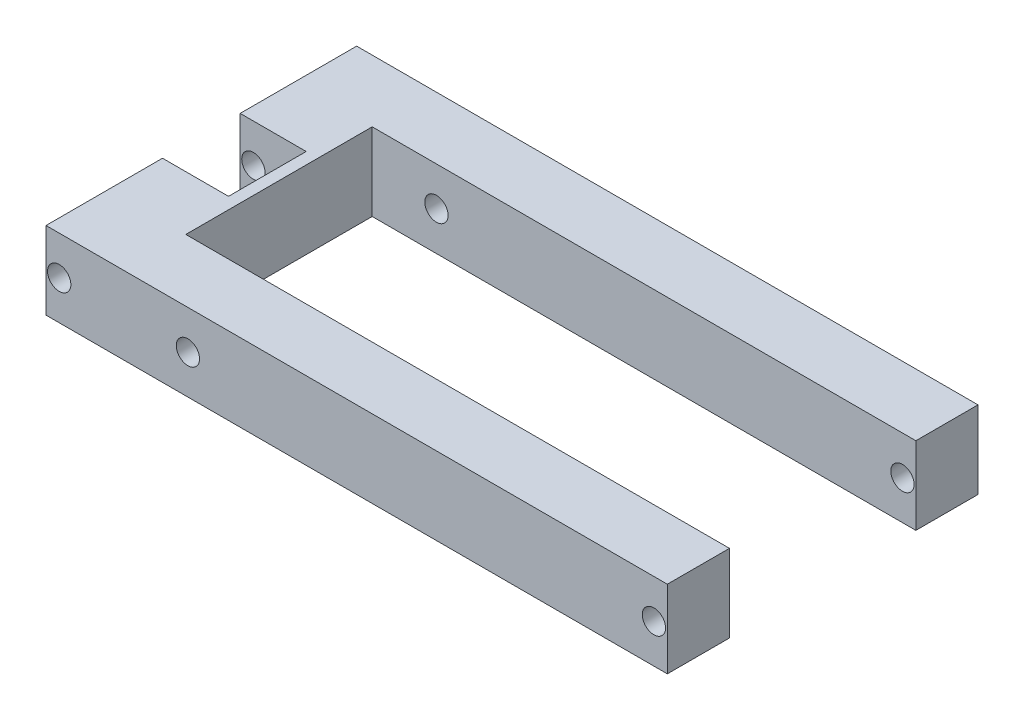
ISO-10303-21;
HEADER;
FILE_DESCRIPTION(('STEP AP214'),'2;1');
FILE_NAME('part.step','',(''),(''),'','','');
FILE_SCHEMA(('AUTOMOTIVE_DESIGN { 1 0 10303 214 1 1 1 1 }'));
ENDSEC;
DATA;
#1=APPLICATION_CONTEXT('core data for automotive mechanical design processes');
#2=APPLICATION_PROTOCOL_DEFINITION('international standard','automotive_design',2000,#1);
#3=PRODUCT_CONTEXT('',#1,'mechanical');
#4=PRODUCT('Part','Part','',(#3));
#5=PRODUCT_RELATED_PRODUCT_CATEGORY('part','',(#4));
#6=PRODUCT_DEFINITION_FORMATION('','',#4);
#7=PRODUCT_DEFINITION_CONTEXT('part definition',#1,'design');
#8=PRODUCT_DEFINITION('design','',#6,#7);
#9=PRODUCT_DEFINITION_SHAPE('','',#8);
#10=(LENGTH_UNIT() NAMED_UNIT(*) SI_UNIT(.MILLI.,.METRE.));
#11=(NAMED_UNIT(*) PLANE_ANGLE_UNIT() SI_UNIT($,.RADIAN.));
#12=(NAMED_UNIT(*) SI_UNIT($,.STERADIAN.) SOLID_ANGLE_UNIT());
#13=UNCERTAINTY_MEASURE_WITH_UNIT(LENGTH_MEASURE(1.E-05),#10,'distance_accuracy_value','');
#14=(GEOMETRIC_REPRESENTATION_CONTEXT(3) GLOBAL_UNCERTAINTY_ASSIGNED_CONTEXT((#13)) GLOBAL_UNIT_ASSIGNED_CONTEXT((#10,
#11,#12)) REPRESENTATION_CONTEXT('',''));
#15=CARTESIAN_POINT('',(0.,0.,0.));
#16=DIRECTION('',(0.,0.,1.));
#17=DIRECTION('',(1.,0.,0.));
#18=AXIS2_PLACEMENT_3D('',#15,#16,#17);
#19=CARTESIAN_POINT('',(-332.846822005894,100.,200.));
#20=DIRECTION('',(1.,0.,0.));
#21=DIRECTION('',(0.,0.,-1.));
#22=AXIS2_PLACEMENT_3D('',#19,#20,#21);
#23=PLANE('',#22);
#24=DIRECTION('',(0.,-1.,0.));
#25=VECTOR('',#24,1.);
#26=CARTESIAN_POINT('',(-332.846822005894,100.,50.));
#27=LINE('',#26,#25);
#28=CARTESIAN_POINT('',(-332.846822005894,100.,50.));
#29=VERTEX_POINT('',#28);
#30=CARTESIAN_POINT('',(-332.846822005894,0.,50.));
#31=VERTEX_POINT('',#30);
#32=EDGE_CURVE('E215',#29,#31,#27,.T.);
#33=ORIENTED_EDGE('',*,*,#32,.T.);
#34=DIRECTION('',(0.,0.,1.));
#35=VECTOR('',#34,1.);
#36=CARTESIAN_POINT('',(-332.846822005894,0.,200.));
#37=LINE('',#36,#35);
#38=CARTESIAN_POINT('',(-332.846822005894,0.,200.));
#39=VERTEX_POINT('',#38);
#40=EDGE_CURVE('E144',#31,#39,#37,.T.);
#41=ORIENTED_EDGE('',*,*,#40,.T.);
#42=DIRECTION('',(0.,-1.,0.));
#43=VECTOR('',#42,1.);
#44=CARTESIAN_POINT('',(-332.846822005894,100.,200.));
#45=LINE('',#44,#43);
#46=CARTESIAN_POINT('',(-332.846822005894,100.,200.));
#47=VERTEX_POINT('',#46);
#48=EDGE_CURVE('E142',#47,#39,#45,.T.);
#49=ORIENTED_EDGE('',*,*,#48,.F.);
#50=DIRECTION('',(0.,0.,1.));
#51=VECTOR('',#50,1.);
#52=CARTESIAN_POINT('',(-332.846822005894,100.,200.));
#53=LINE('',#52,#51);
#54=EDGE_CURVE('E124',#29,#47,#53,.T.);
#55=ORIENTED_EDGE('',*,*,#54,.F.);
#56=EDGE_LOOP('',(#33,#41,#49,#55));
#57=FACE_BOUND('',#56,.T.);
#58=ADVANCED_FACE('F39',(#57),#23,.F.);
#59=CARTESIAN_POINT('',(-315.846822005894,50.,-200.));
#60=DIRECTION('',(0.,0.,1.));
#61=DIRECTION('',(1.,0.,0.));
#62=AXIS2_PLACEMENT_3D('',#59,#60,#61);
#63=CYLINDRICAL_SURFACE('',#62,15.);
#64=CARTESIAN_POINT('',(-315.846822005894,50.,200.));
#65=DIRECTION('',(0.,0.,1.));
#66=DIRECTION('',(1.,0.,0.));
#67=AXIS2_PLACEMENT_3D('',#64,#65,#66);
#68=CIRCLE('',#67,15.);
#69=CARTESIAN_POINT('',(-300.846822005894,50.,200.));
#70=VERTEX_POINT('',#69);
#71=EDGE_CURVE('E232',#70,#70,#68,.T.);
#72=ORIENTED_EDGE('',*,*,#71,.T.);
#73=EDGE_LOOP('',(#72));
#74=FACE_BOUND('',#73,.T.);
#75=CARTESIAN_POINT('',(-315.846822005894,50.,50.));
#76=DIRECTION('',(0.,0.,-1.));
#77=DIRECTION('',(-1.,0.,0.));
#78=AXIS2_PLACEMENT_3D('',#75,#76,#77);
#79=CIRCLE('',#78,15.);
#80=CARTESIAN_POINT('',(-330.846822005894,50.,50.));
#81=VERTEX_POINT('',#80);
#82=EDGE_CURVE('E205',#81,#81,#79,.F.);
#83=ORIENTED_EDGE('',*,*,#82,.F.);
#84=EDGE_LOOP('',(#83));
#85=FACE_BOUND('',#84,.T.);
#86=ADVANCED_FACE('F352',(#74,#85),#63,.F.);
#87=CARTESIAN_POINT('',(467.153177994106,100.,120.));
#88=DIRECTION('',(0.,0.,1.));
#89=DIRECTION('',(1.,0.,0.));
#90=AXIS2_PLACEMENT_3D('',#87,#88,#89);
#91=PLANE('',#90);
#92=CARTESIAN_POINT('',(-150.146822005894,50.,120.));
#93=DIRECTION('',(0.,0.,1.));
#94=DIRECTION('',(1.,0.,0.));
#95=AXIS2_PLACEMENT_3D('',#92,#93,#94);
#96=CIRCLE('',#95,15.0000000000001);
#97=CARTESIAN_POINT('',(-135.146822005894,50.,120.));
#98=VERTEX_POINT('',#97);
#99=EDGE_CURVE('E166',#98,#98,#96,.T.);
#100=ORIENTED_EDGE('',*,*,#99,.T.);
#101=EDGE_LOOP('',(#100));
#102=FACE_BOUND('',#101,.T.);
#103=CARTESIAN_POINT('',(449.853177994106,50.,120.));
#104=DIRECTION('',(0.,0.,1.));
#105=DIRECTION('',(1.,0.,0.));
#106=AXIS2_PLACEMENT_3D('',#103,#104,#105);
#107=CIRCLE('',#106,15.);
#108=CARTESIAN_POINT('',(464.853177994106,50.,120.));
#109=VERTEX_POINT('',#108);
#110=EDGE_CURVE('E259',#109,#109,#107,.T.);
#111=ORIENTED_EDGE('',*,*,#110,.T.);
#112=EDGE_LOOP('',(#111));
#113=FACE_BOUND('',#112,.T.);
#114=DIRECTION('',(-1.,0.,0.));
#115=VECTOR('',#114,1.);
#116=CARTESIAN_POINT('',(467.153177994106,0.,120.));
#117=LINE('',#116,#115);
#118=CARTESIAN_POINT('',(467.153177994106,0.,120.));
#119=VERTEX_POINT('',#118);
#120=CARTESIAN_POINT('',(-232.846822005894,0.,120.));
#121=VERTEX_POINT('',#120);
#122=EDGE_CURVE('E161',#119,#121,#117,.T.);
#123=ORIENTED_EDGE('',*,*,#122,.T.);
#124=DIRECTION('',(0.,-1.,0.));
#125=VECTOR('',#124,1.);
#126=CARTESIAN_POINT('',(-232.846822005894,100.,120.));
#127=LINE('',#126,#125);
#128=CARTESIAN_POINT('',(-232.846822005894,100.,120.));
#129=VERTEX_POINT('',#128);
#130=EDGE_CURVE('E11',#129,#121,#127,.T.);
#131=ORIENTED_EDGE('',*,*,#130,.F.);
#132=DIRECTION('',(-1.,0.,0.));
#133=VECTOR('',#132,1.);
#134=CARTESIAN_POINT('',(467.153177994106,100.,120.));
#135=LINE('',#134,#133);
#136=CARTESIAN_POINT('',(467.153177994106,100.,120.));
#137=VERTEX_POINT('',#136);
#138=EDGE_CURVE('E187',#137,#129,#135,.T.);
#139=ORIENTED_EDGE('',*,*,#138,.F.);
#140=DIRECTION('',(0.,-1.,0.));
#141=VECTOR('',#140,1.);
#142=CARTESIAN_POINT('',(467.153177994106,100.,120.));
#143=LINE('',#142,#141);
#144=EDGE_CURVE('E156',#137,#119,#143,.T.);
#145=ORIENTED_EDGE('',*,*,#144,.T.);
#146=EDGE_LOOP('',(#123,#131,#139,#145));
#147=FACE_BOUND('',#146,.T.);
#148=ADVANCED_FACE('F41',(#102,#113,#147),#91,.F.);
#149=CARTESIAN_POINT('',(-232.846822005894,100.,-120.));
#150=DIRECTION('',(-1.,0.,0.));
#151=DIRECTION('',(0.,0.,1.));
#152=AXIS2_PLACEMENT_3D('',#149,#150,#151);
#153=PLANE('',#152);
#154=DIRECTION('',(0.,0.,-1.));
#155=VECTOR('',#154,1.);
#156=CARTESIAN_POINT('',(-232.846822005894,0.,-120.));
#157=LINE('',#156,#155);
#158=CARTESIAN_POINT('',(-232.846822005894,0.,-120.));
#159=VERTEX_POINT('',#158);
#160=EDGE_CURVE('E165',#121,#159,#157,.T.);
#161=ORIENTED_EDGE('',*,*,#160,.T.);
#162=DIRECTION('',(0.,-1.,0.));
#163=VECTOR('',#162,1.);
#164=CARTESIAN_POINT('',(-232.846822005894,100.,-120.));
#165=LINE('',#164,#163);
#166=CARTESIAN_POINT('',(-232.846822005894,100.,-120.));
#167=VERTEX_POINT('',#166);
#168=EDGE_CURVE('E49',#167,#159,#165,.T.);
#169=ORIENTED_EDGE('',*,*,#168,.F.);
#170=DIRECTION('',(0.,0.,-1.));
#171=VECTOR('',#170,1.);
#172=CARTESIAN_POINT('',(-232.846822005894,100.,-120.));
#173=LINE('',#172,#171);
#174=EDGE_CURVE('E107',#129,#167,#173,.T.);
#175=ORIENTED_EDGE('',*,*,#174,.F.);
#176=ORIENTED_EDGE('',*,*,#130,.T.);
#177=EDGE_LOOP('',(#161,#169,#175,#176));
#178=FACE_BOUND('',#177,.T.);
#179=ADVANCED_FACE('F334',(#178),#153,.F.);
#180=CARTESIAN_POINT('',(467.153177994106,100.,-120.));
#181=DIRECTION('',(0.,0.,-1.));
#182=DIRECTION('',(-1.,0.,0.));
#183=AXIS2_PLACEMENT_3D('',#180,#181,#182);
#184=PLANE('',#183);
#185=CARTESIAN_POINT('',(-150.146822005894,50.,-120.));
#186=DIRECTION('',(0.,0.,-1.));
#187=DIRECTION('',(-1.,0.,0.));
#188=AXIS2_PLACEMENT_3D('',#185,#186,#187);
#189=CIRCLE('',#188,15.0000000000001);
#190=CARTESIAN_POINT('',(-165.146822005894,50.,-120.));
#191=VERTEX_POINT('',#190);
#192=EDGE_CURVE('E263',#191,#191,#189,.T.);
#193=ORIENTED_EDGE('',*,*,#192,.T.);
#194=EDGE_LOOP('',(#193));
#195=FACE_BOUND('',#194,.T.);
#196=CARTESIAN_POINT('',(449.853177994106,50.,-120.));
#197=DIRECTION('',(0.,0.,-1.));
#198=DIRECTION('',(-1.,0.,0.));
#199=AXIS2_PLACEMENT_3D('',#196,#197,#198);
#200=CIRCLE('',#199,15.);
#201=CARTESIAN_POINT('',(434.853177994106,50.,-120.));
#202=VERTEX_POINT('',#201);
#203=EDGE_CURVE('E241',#202,#202,#200,.T.);
#204=ORIENTED_EDGE('',*,*,#203,.T.);
#205=EDGE_LOOP('',(#204));
#206=FACE_BOUND('',#205,.T.);
#207=DIRECTION('',(1.,0.,0.));
#208=VECTOR('',#207,1.);
#209=CARTESIAN_POINT('',(467.153177994106,0.,-120.));
#210=LINE('',#209,#208);
#211=CARTESIAN_POINT('',(467.153177994106,0.,-120.));
#212=VERTEX_POINT('',#211);
#213=EDGE_CURVE('E169',#159,#212,#210,.T.);
#214=ORIENTED_EDGE('',*,*,#213,.T.);
#215=DIRECTION('',(0.,-1.,0.));
#216=VECTOR('',#215,1.);
#217=CARTESIAN_POINT('',(467.153177994106,100.,-120.));
#218=LINE('',#217,#216);
#219=CARTESIAN_POINT('',(467.153177994106,100.,-120.));
#220=VERTEX_POINT('',#219);
#221=EDGE_CURVE('E199',#220,#212,#218,.T.);
#222=ORIENTED_EDGE('',*,*,#221,.F.);
#223=DIRECTION('',(1.,0.,0.));
#224=VECTOR('',#223,1.);
#225=CARTESIAN_POINT('',(467.153177994106,100.,-120.));
#226=LINE('',#225,#224);
#227=EDGE_CURVE('E274',#167,#220,#226,.T.);
#228=ORIENTED_EDGE('',*,*,#227,.F.);
#229=ORIENTED_EDGE('',*,*,#168,.T.);
#230=EDGE_LOOP('',(#214,#222,#228,#229));
#231=FACE_BOUND('',#230,.T.);
#232=ADVANCED_FACE('F337',(#195,#206,#231),#184,.F.);
#233=CARTESIAN_POINT('',(467.153177994106,100.,-200.));
#234=DIRECTION('',(-1.,0.,0.));
#235=DIRECTION('',(0.,0.,1.));
#236=AXIS2_PLACEMENT_3D('',#233,#234,#235);
#237=PLANE('',#236);
#238=DIRECTION('',(0.,0.,-1.));
#239=VECTOR('',#238,1.);
#240=CARTESIAN_POINT('',(467.153177994106,0.,-200.));
#241=LINE('',#240,#239);
#242=CARTESIAN_POINT('',(467.153177994106,0.,-200.));
#243=VERTEX_POINT('',#242);
#244=EDGE_CURVE('E172',#212,#243,#241,.T.);
#245=ORIENTED_EDGE('',*,*,#244,.T.);
#246=DIRECTION('',(0.,-1.,0.));
#247=VECTOR('',#246,1.);
#248=CARTESIAN_POINT('',(467.153177994106,100.,-200.));
#249=LINE('',#248,#247);
#250=CARTESIAN_POINT('',(467.153177994106,100.,-200.));
#251=VERTEX_POINT('',#250);
#252=EDGE_CURVE('E195',#251,#243,#249,.T.);
#253=ORIENTED_EDGE('',*,*,#252,.F.);
#254=DIRECTION('',(0.,0.,-1.));
#255=VECTOR('',#254,1.);
#256=CARTESIAN_POINT('',(467.153177994106,100.,-200.));
#257=LINE('',#256,#255);
#258=EDGE_CURVE('E277',#220,#251,#257,.T.);
#259=ORIENTED_EDGE('',*,*,#258,.F.);
#260=ORIENTED_EDGE('',*,*,#221,.T.);
#261=EDGE_LOOP('',(#245,#253,#259,#260));
#262=FACE_BOUND('',#261,.T.);
#263=ADVANCED_FACE('F340',(#262),#237,.F.);
#264=CARTESIAN_POINT('',(-332.846822005894,100.,-200.));
#265=DIRECTION('',(0.,0.,1.));
#266=DIRECTION('',(1.,0.,0.));
#267=AXIS2_PLACEMENT_3D('',#264,#265,#266);
#268=PLANE('',#267);
#269=CARTESIAN_POINT('',(-315.846822005894,50.,-200.));
#270=DIRECTION('',(0.,0.,1.));
#271=DIRECTION('',(1.,0.,0.));
#272=AXIS2_PLACEMENT_3D('',#269,#270,#271);
#273=CIRCLE('',#272,15.);
#274=CARTESIAN_POINT('',(-300.846822005894,50.,-200.));
#275=VERTEX_POINT('',#274);
#276=EDGE_CURVE('E236',#275,#275,#273,.T.);
#277=ORIENTED_EDGE('',*,*,#276,.T.);
#278=EDGE_LOOP('',(#277));
#279=FACE_BOUND('',#278,.T.);
#280=CARTESIAN_POINT('',(-150.146822005894,50.,-200.));
#281=DIRECTION('',(0.,0.,1.));
#282=DIRECTION('',(1.,0.,0.));
#283=AXIS2_PLACEMENT_3D('',#280,#281,#282);
#284=CIRCLE('',#283,15.0000000000001);
#285=CARTESIAN_POINT('',(-135.146822005894,50.,-200.));
#286=VERTEX_POINT('',#285);
#287=EDGE_CURVE('E237',#286,#286,#284,.T.);
#288=ORIENTED_EDGE('',*,*,#287,.T.);
#289=EDGE_LOOP('',(#288));
#290=FACE_BOUND('',#289,.T.);
#291=CARTESIAN_POINT('',(449.853177994106,50.,-200.));
#292=DIRECTION('',(0.,0.,1.));
#293=DIRECTION('',(1.,0.,0.));
#294=AXIS2_PLACEMENT_3D('',#291,#292,#293);
#295=CIRCLE('',#294,15.);
#296=CARTESIAN_POINT('',(464.853177994106,50.,-200.));
#297=VERTEX_POINT('',#296);
#298=EDGE_CURVE('E246',#297,#297,#295,.T.);
#299=ORIENTED_EDGE('',*,*,#298,.T.);
#300=EDGE_LOOP('',(#299));
#301=FACE_BOUND('',#300,.T.);
#302=DIRECTION('',(-1.,0.,0.));
#303=VECTOR('',#302,1.);
#304=CARTESIAN_POINT('',(-332.846822005894,0.,-200.));
#305=LINE('',#304,#303);
#306=CARTESIAN_POINT('',(-332.846822005894,0.,-200.));
#307=VERTEX_POINT('',#306);
#308=EDGE_CURVE('E175',#243,#307,#305,.T.);
#309=ORIENTED_EDGE('',*,*,#308,.T.);
#310=DIRECTION('',(0.,-1.,0.));
#311=VECTOR('',#310,1.);
#312=CARTESIAN_POINT('',(-332.846822005894,100.,-200.));
#313=LINE('',#312,#311);
#314=CARTESIAN_POINT('',(-332.846822005894,100.,-200.));
#315=VERTEX_POINT('',#314);
#316=EDGE_CURVE('E148',#315,#307,#313,.T.);
#317=ORIENTED_EDGE('',*,*,#316,.F.);
#318=DIRECTION('',(-1.,0.,0.));
#319=VECTOR('',#318,1.);
#320=CARTESIAN_POINT('',(-332.846822005894,100.,-200.));
#321=LINE('',#320,#319);
#322=EDGE_CURVE('E139',#251,#315,#321,.T.);
#323=ORIENTED_EDGE('',*,*,#322,.F.);
#324=ORIENTED_EDGE('',*,*,#252,.T.);
#325=EDGE_LOOP('',(#309,#317,#323,#324));
#326=FACE_BOUND('',#325,.T.);
#327=ADVANCED_FACE('F286',(#279,#290,#301,#326),#268,.F.);
#328=CARTESIAN_POINT('',(-332.846822005894,0.,-50.));
#329=VERTEX_POINT('',#328);
#330=EDGE_CURVE('E178',#307,#329,#37,.T.);
#331=ORIENTED_EDGE('',*,*,#330,.T.);
#332=DIRECTION('',(0.,-1.,0.));
#333=VECTOR('',#332,1.);
#334=CARTESIAN_POINT('',(-332.846822005894,100.,-50.));
#335=LINE('',#334,#333);
#336=CARTESIAN_POINT('',(-332.846822005894,100.,-50.));
#337=VERTEX_POINT('',#336);
#338=EDGE_CURVE('E208',#337,#329,#335,.T.);
#339=ORIENTED_EDGE('',*,*,#338,.F.);
#340=EDGE_CURVE('E138',#315,#337,#53,.T.);
#341=ORIENTED_EDGE('',*,*,#340,.F.);
#342=ORIENTED_EDGE('',*,*,#316,.T.);
#343=EDGE_LOOP('',(#331,#339,#341,#342));
#344=FACE_BOUND('',#343,.T.);
#345=ADVANCED_FACE('F290',(#344),#23,.F.);
#346=CARTESIAN_POINT('',(-332.846822005894,100.,200.));
#347=DIRECTION('',(0.,0.,-1.));
#348=DIRECTION('',(-1.,0.,0.));
#349=AXIS2_PLACEMENT_3D('',#346,#347,#348);
#350=PLANE('',#349);
#351=ORIENTED_EDGE('',*,*,#71,.F.);
#352=EDGE_LOOP('',(#351));
#353=FACE_BOUND('',#352,.T.);
#354=CARTESIAN_POINT('',(-150.146822005894,50.,200.));
#355=DIRECTION('',(0.,0.,1.));
#356=DIRECTION('',(1.,0.,0.));
#357=AXIS2_PLACEMENT_3D('',#354,#355,#356);
#358=CIRCLE('',#357,15.0000000000001);
#359=CARTESIAN_POINT('',(-135.146822005894,50.,200.));
#360=VERTEX_POINT('',#359);
#361=EDGE_CURVE('E242',#360,#360,#358,.T.);
#362=ORIENTED_EDGE('',*,*,#361,.F.);
#363=EDGE_LOOP('',(#362));
#364=FACE_BOUND('',#363,.T.);
#365=CARTESIAN_POINT('',(449.853177994106,50.,200.));
#366=DIRECTION('',(0.,0.,1.));
#367=DIRECTION('',(1.,0.,0.));
#368=AXIS2_PLACEMENT_3D('',#365,#366,#367);
#369=CIRCLE('',#368,15.);
#370=CARTESIAN_POINT('',(464.853177994106,50.,200.));
#371=VERTEX_POINT('',#370);
#372=EDGE_CURVE('E214',#371,#371,#369,.T.);
#373=ORIENTED_EDGE('',*,*,#372,.F.);
#374=EDGE_LOOP('',(#373));
#375=FACE_BOUND('',#374,.T.);
#376=DIRECTION('',(1.,0.,0.));
#377=VECTOR('',#376,1.);
#378=CARTESIAN_POINT('',(-332.846822005894,0.,200.));
#379=LINE('',#378,#377);
#380=CARTESIAN_POINT('',(467.153177994106,0.,200.));
#381=VERTEX_POINT('',#380);
#382=EDGE_CURVE('E182',#39,#381,#379,.T.);
#383=ORIENTED_EDGE('',*,*,#382,.T.);
#384=DIRECTION('',(0.,-1.,0.));
#385=VECTOR('',#384,1.);
#386=CARTESIAN_POINT('',(467.153177994106,100.,200.));
#387=LINE('',#386,#385);
#388=CARTESIAN_POINT('',(467.153177994106,100.,200.));
#389=VERTEX_POINT('',#388);
#390=EDGE_CURVE('E149',#389,#381,#387,.T.);
#391=ORIENTED_EDGE('',*,*,#390,.F.);
#392=DIRECTION('',(1.,0.,0.));
#393=VECTOR('',#392,1.);
#394=CARTESIAN_POINT('',(-332.846822005894,100.,200.));
#395=LINE('',#394,#393);
#396=EDGE_CURVE('E129',#47,#389,#395,.T.);
#397=ORIENTED_EDGE('',*,*,#396,.F.);
#398=ORIENTED_EDGE('',*,*,#48,.T.);
#399=EDGE_LOOP('',(#383,#391,#397,#398));
#400=FACE_BOUND('',#399,.T.);
#401=ADVANCED_FACE('F151',(#353,#364,#375,#400),#350,.F.);
#402=CARTESIAN_POINT('',(467.153177994106,100.,200.));
#403=DIRECTION('',(-1.,0.,0.));
#404=DIRECTION('',(0.,0.,1.));
#405=AXIS2_PLACEMENT_3D('',#402,#403,#404);
#406=PLANE('',#405);
#407=DIRECTION('',(0.,0.,-1.));
#408=VECTOR('',#407,1.);
#409=CARTESIAN_POINT('',(467.153177994106,0.,200.));
#410=LINE('',#409,#408);
#411=EDGE_CURVE('E99',#381,#119,#410,.T.);
#412=ORIENTED_EDGE('',*,*,#411,.T.);
#413=ORIENTED_EDGE('',*,*,#144,.F.);
#414=DIRECTION('',(0.,0.,-1.));
#415=VECTOR('',#414,1.);
#416=CARTESIAN_POINT('',(467.153177994106,100.,200.));
#417=LINE('',#416,#415);
#418=EDGE_CURVE('E66',#389,#137,#417,.T.);
#419=ORIENTED_EDGE('',*,*,#418,.F.);
#420=ORIENTED_EDGE('',*,*,#390,.T.);
#421=EDGE_LOOP('',(#412,#413,#419,#420));
#422=FACE_BOUND('',#421,.T.);
#423=ADVANCED_FACE('F328',(#422),#406,.F.);
#424=CARTESIAN_POINT('',(0.,100.,0.));
#425=DIRECTION('',(0.,1.,0.));
#426=DIRECTION('',(0.,0.,1.));
#427=AXIS2_PLACEMENT_3D('',#424,#425,#426);
#428=PLANE('',#427);
#429=DIRECTION('',(1.,0.,0.));
#430=VECTOR('',#429,1.);
#431=CARTESIAN_POINT('',(-332.846822005894,100.,-50.));
#432=LINE('',#431,#430);
#433=CARTESIAN_POINT('',(-247.846822005894,100.,-50.));
#434=VERTEX_POINT('',#433);
#435=EDGE_CURVE('E292',#337,#434,#432,.T.);
#436=ORIENTED_EDGE('',*,*,#435,.T.);
#437=DIRECTION('',(0.,0.,1.));
#438=VECTOR('',#437,1.);
#439=CARTESIAN_POINT('',(-247.846822005894,100.,-50.));
#440=LINE('',#439,#438);
#441=CARTESIAN_POINT('',(-247.846822005894,100.,50.));
#442=VERTEX_POINT('',#441);
#443=EDGE_CURVE('E310',#434,#442,#440,.T.);
#444=ORIENTED_EDGE('',*,*,#443,.T.);
#445=DIRECTION('',(1.,0.,0.));
#446=VECTOR('',#445,1.);
#447=CARTESIAN_POINT('',(-332.846822005894,100.,50.));
#448=LINE('',#447,#446);
#449=EDGE_CURVE('E134',#29,#442,#448,.T.);
#450=ORIENTED_EDGE('',*,*,#449,.F.);
#451=ORIENTED_EDGE('',*,*,#54,.T.);
#452=ORIENTED_EDGE('',*,*,#396,.T.);
#453=ORIENTED_EDGE('',*,*,#418,.T.);
#454=ORIENTED_EDGE('',*,*,#138,.T.);
#455=ORIENTED_EDGE('',*,*,#174,.T.);
#456=ORIENTED_EDGE('',*,*,#227,.T.);
#457=ORIENTED_EDGE('',*,*,#258,.T.);
#458=ORIENTED_EDGE('',*,*,#322,.T.);
#459=ORIENTED_EDGE('',*,*,#340,.T.);
#460=EDGE_LOOP('',(#436,#444,#450,#451,#452,#453,#454,#455,#456,#457,#458,#459));
#461=FACE_BOUND('',#460,.T.);
#462=ADVANCED_FACE('F127',(#461),#428,.T.);
#463=CARTESIAN_POINT('',(0.,0.,0.));
#464=DIRECTION('',(0.,1.,0.));
#465=DIRECTION('',(0.,0.,1.));
#466=AXIS2_PLACEMENT_3D('',#463,#464,#465);
#467=PLANE('',#466);
#468=DIRECTION('',(0.,0.,1.));
#469=VECTOR('',#468,1.);
#470=CARTESIAN_POINT('',(-247.846822005894,0.,-50.));
#471=LINE('',#470,#469);
#472=CARTESIAN_POINT('',(-247.846822005894,0.,-50.));
#473=VERTEX_POINT('',#472);
#474=CARTESIAN_POINT('',(-247.846822005894,0.,50.));
#475=VERTEX_POINT('',#474);
#476=EDGE_CURVE('E315',#473,#475,#471,.T.);
#477=ORIENTED_EDGE('',*,*,#476,.F.);
#478=DIRECTION('',(1.,0.,0.));
#479=VECTOR('',#478,1.);
#480=CARTESIAN_POINT('',(-332.846822005894,0.,-50.));
#481=LINE('',#480,#479);
#482=EDGE_CURVE('E57',#329,#473,#481,.T.);
#483=ORIENTED_EDGE('',*,*,#482,.F.);
#484=ORIENTED_EDGE('',*,*,#330,.F.);
#485=ORIENTED_EDGE('',*,*,#308,.F.);
#486=ORIENTED_EDGE('',*,*,#244,.F.);
#487=ORIENTED_EDGE('',*,*,#213,.F.);
#488=ORIENTED_EDGE('',*,*,#160,.F.);
#489=ORIENTED_EDGE('',*,*,#122,.F.);
#490=ORIENTED_EDGE('',*,*,#411,.F.);
#491=ORIENTED_EDGE('',*,*,#382,.F.);
#492=ORIENTED_EDGE('',*,*,#40,.F.);
#493=DIRECTION('',(1.,0.,0.));
#494=VECTOR('',#493,1.);
#495=CARTESIAN_POINT('',(-332.846822005894,0.,50.));
#496=LINE('',#495,#494);
#497=EDGE_CURVE('E223',#31,#475,#496,.T.);
#498=ORIENTED_EDGE('',*,*,#497,.T.);
#499=EDGE_LOOP('',(#477,#483,#484,#485,#486,#487,#488,#489,#490,#491,#492,#498));
#500=FACE_BOUND('',#499,.T.);
#501=ADVANCED_FACE('F325',(#500),#467,.F.);
#502=CARTESIAN_POINT('',(449.853177994106,50.,-200.));
#503=DIRECTION('',(0.,0.,1.));
#504=DIRECTION('',(1.,0.,0.));
#505=AXIS2_PLACEMENT_3D('',#502,#503,#504);
#506=CYLINDRICAL_SURFACE('',#505,15.);
#507=ORIENTED_EDGE('',*,*,#372,.T.);
#508=EDGE_LOOP('',(#507));
#509=FACE_BOUND('',#508,.T.);
#510=ORIENTED_EDGE('',*,*,#110,.F.);
#511=EDGE_LOOP('',(#510));
#512=FACE_BOUND('',#511,.T.);
#513=ADVANCED_FACE('F375',(#509,#512),#506,.F.);
#514=CARTESIAN_POINT('',(-150.146822005894,50.,-200.));
#515=DIRECTION('',(0.,0.,1.));
#516=DIRECTION('',(1.,0.,0.));
#517=AXIS2_PLACEMENT_3D('',#514,#515,#516);
#518=CYLINDRICAL_SURFACE('',#517,15.0000000000001);
#519=ORIENTED_EDGE('',*,*,#361,.T.);
#520=EDGE_LOOP('',(#519));
#521=FACE_BOUND('',#520,.T.);
#522=ORIENTED_EDGE('',*,*,#99,.F.);
#523=EDGE_LOOP('',(#522));
#524=FACE_BOUND('',#523,.T.);
#525=ADVANCED_FACE('F380',(#521,#524),#518,.F.);
#526=CARTESIAN_POINT('',(-315.846822005894,50.,-50.));
#527=DIRECTION('',(0.,0.,-1.));
#528=DIRECTION('',(-1.,0.,0.));
#529=AXIS2_PLACEMENT_3D('',#526,#527,#528);
#530=CIRCLE('',#529,15.);
#531=CARTESIAN_POINT('',(-330.846822005894,50.,-50.));
#532=VERTEX_POINT('',#531);
#533=EDGE_CURVE('E43',#532,#532,#530,.F.);
#534=ORIENTED_EDGE('',*,*,#533,.T.);
#535=EDGE_LOOP('',(#534));
#536=FACE_BOUND('',#535,.T.);
#537=ORIENTED_EDGE('',*,*,#276,.F.);
#538=EDGE_LOOP('',(#537));
#539=FACE_BOUND('',#538,.T.);
#540=ADVANCED_FACE('F359',(#536,#539),#63,.F.);
#541=ORIENTED_EDGE('',*,*,#298,.F.);
#542=EDGE_LOOP('',(#541));
#543=FACE_BOUND('',#542,.T.);
#544=ORIENTED_EDGE('',*,*,#203,.F.);
#545=EDGE_LOOP('',(#544));
#546=FACE_BOUND('',#545,.T.);
#547=ADVANCED_FACE('F382',(#543,#546),#506,.F.);
#548=ORIENTED_EDGE('',*,*,#287,.F.);
#549=EDGE_LOOP('',(#548));
#550=FACE_BOUND('',#549,.T.);
#551=ORIENTED_EDGE('',*,*,#192,.F.);
#552=EDGE_LOOP('',(#551));
#553=FACE_BOUND('',#552,.T.);
#554=ADVANCED_FACE('F385',(#550,#553),#518,.F.);
#555=CARTESIAN_POINT('',(-332.846822005894,100.,-50.));
#556=DIRECTION('',(0.,0.,-1.));
#557=DIRECTION('',(-1.,0.,0.));
#558=AXIS2_PLACEMENT_3D('',#555,#556,#557);
#559=PLANE('',#558);
#560=ORIENTED_EDGE('',*,*,#482,.T.);
#561=DIRECTION('',(0.,-1.,0.));
#562=VECTOR('',#561,1.);
#563=CARTESIAN_POINT('',(-247.846822005894,100.,-50.));
#564=LINE('',#563,#562);
#565=EDGE_CURVE('E229',#434,#473,#564,.T.);
#566=ORIENTED_EDGE('',*,*,#565,.F.);
#567=ORIENTED_EDGE('',*,*,#435,.F.);
#568=ORIENTED_EDGE('',*,*,#338,.T.);
#569=EDGE_LOOP('',(#560,#566,#567,#568));
#570=FACE_BOUND('',#569,.T.);
#571=ORIENTED_EDGE('',*,*,#533,.F.);
#572=EDGE_LOOP('',(#571));
#573=FACE_BOUND('',#572,.T.);
#574=ADVANCED_FACE('F389',(#570,#573),#559,.F.);
#575=CARTESIAN_POINT('',(-332.846822005894,100.,50.));
#576=DIRECTION('',(0.,0.,-1.));
#577=DIRECTION('',(-1.,0.,0.));
#578=AXIS2_PLACEMENT_3D('',#575,#576,#577);
#579=PLANE('',#578);
#580=ORIENTED_EDGE('',*,*,#497,.F.);
#581=ORIENTED_EDGE('',*,*,#32,.F.);
#582=ORIENTED_EDGE('',*,*,#449,.T.);
#583=DIRECTION('',(0.,-1.,0.));
#584=VECTOR('',#583,1.);
#585=CARTESIAN_POINT('',(-247.846822005894,100.,50.));
#586=LINE('',#585,#584);
#587=EDGE_CURVE('E220',#442,#475,#586,.T.);
#588=ORIENTED_EDGE('',*,*,#587,.T.);
#589=EDGE_LOOP('',(#580,#581,#582,#588));
#590=FACE_BOUND('',#589,.T.);
#591=ORIENTED_EDGE('',*,*,#82,.T.);
#592=EDGE_LOOP('',(#591));
#593=FACE_BOUND('',#592,.T.);
#594=ADVANCED_FACE('F307',(#590,#593),#579,.T.);
#595=CARTESIAN_POINT('',(-247.846822005894,100.,-50.));
#596=DIRECTION('',(1.,0.,0.));
#597=DIRECTION('',(0.,0.,-1.));
#598=AXIS2_PLACEMENT_3D('',#595,#596,#597);
#599=PLANE('',#598);
#600=ORIENTED_EDGE('',*,*,#476,.T.);
#601=ORIENTED_EDGE('',*,*,#587,.F.);
#602=ORIENTED_EDGE('',*,*,#443,.F.);
#603=ORIENTED_EDGE('',*,*,#565,.T.);
#604=EDGE_LOOP('',(#600,#601,#602,#603));
#605=FACE_BOUND('',#604,.T.);
#606=ADVANCED_FACE('F313',(#605),#599,.F.);
#607=CLOSED_SHELL('',(#58,#86,#148,#179,#232,#263,#327,#345,#401,#423,#462,#501,#513,#525,#540,
#547,#554,#574,#594,#606));
#608=MANIFOLD_SOLID_BREP('B2',#607);
#609=ADVANCED_BREP_SHAPE_REPRESENTATION('',(#18,#608),#14);
#610=SHAPE_DEFINITION_REPRESENTATION(#9,#609);
ENDSEC;
END-ISO-10303-21;
